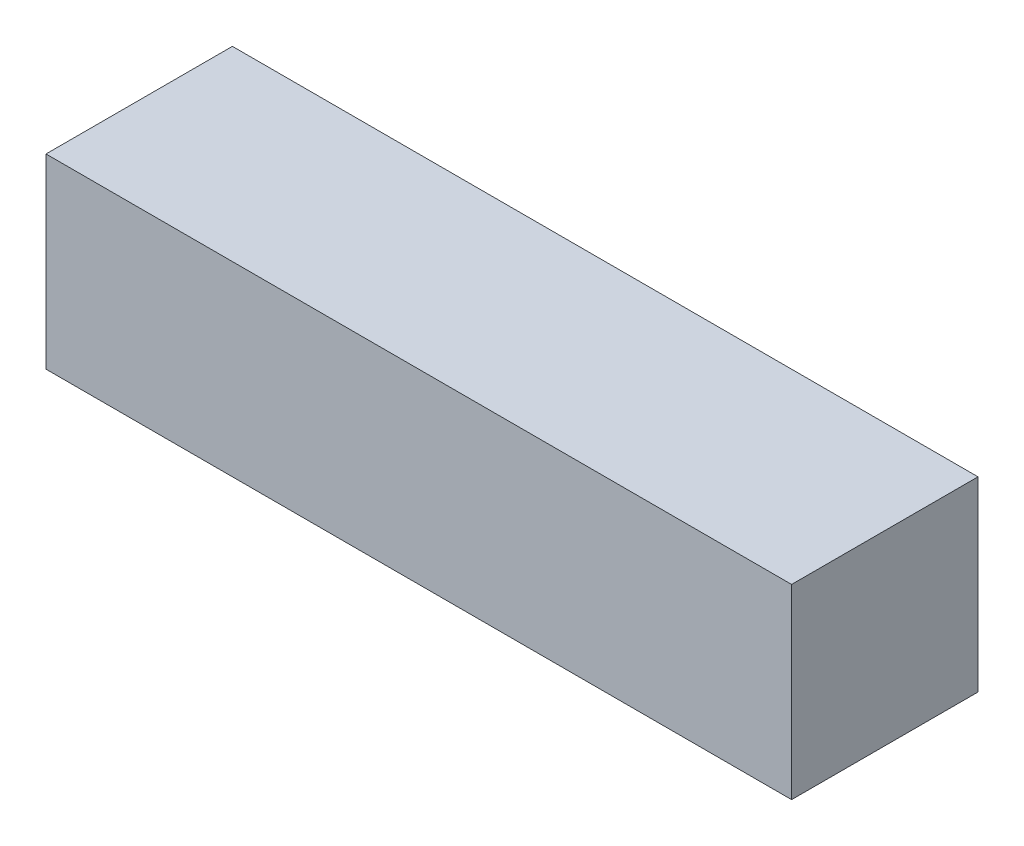
ISO-10303-21;
HEADER;
FILE_DESCRIPTION(('STEP AP214'),'2;1');
FILE_NAME('part.step','',(''),(''),'','','');
FILE_SCHEMA(('AUTOMOTIVE_DESIGN { 1 0 10303 214 1 1 1 1 }'));
ENDSEC;
DATA;
#1=APPLICATION_CONTEXT('core data for automotive mechanical design processes');
#2=APPLICATION_PROTOCOL_DEFINITION('international standard','automotive_design',2000,#1);
#3=PRODUCT_CONTEXT('',#1,'mechanical');
#4=PRODUCT('Part','Part','',(#3));
#5=PRODUCT_RELATED_PRODUCT_CATEGORY('part','',(#4));
#6=PRODUCT_DEFINITION_FORMATION('','',#4);
#7=PRODUCT_DEFINITION_CONTEXT('part definition',#1,'design');
#8=PRODUCT_DEFINITION('design','',#6,#7);
#9=PRODUCT_DEFINITION_SHAPE('','',#8);
#10=(LENGTH_UNIT() NAMED_UNIT(*) SI_UNIT(.MILLI.,.METRE.));
#11=(NAMED_UNIT(*) PLANE_ANGLE_UNIT() SI_UNIT($,.RADIAN.));
#12=(NAMED_UNIT(*) SI_UNIT($,.STERADIAN.) SOLID_ANGLE_UNIT());
#13=UNCERTAINTY_MEASURE_WITH_UNIT(LENGTH_MEASURE(1.E-05),#10,'distance_accuracy_value','');
#14=(GEOMETRIC_REPRESENTATION_CONTEXT(3) GLOBAL_UNCERTAINTY_ASSIGNED_CONTEXT((#13)) GLOBAL_UNIT_ASSIGNED_CONTEXT((#10,
#11,#12)) REPRESENTATION_CONTEXT('',''));
#15=CARTESIAN_POINT('',(0.,0.,0.));
#16=DIRECTION('',(0.,0.,1.));
#17=DIRECTION('',(1.,0.,0.));
#18=AXIS2_PLACEMENT_3D('',#15,#16,#17);
#19=CARTESIAN_POINT('',(0.,0.,35.));
#20=DIRECTION('',(1.,0.,0.));
#21=DIRECTION('',(0.,0.,-1.));
#22=AXIS2_PLACEMENT_3D('',#19,#20,#21);
#23=PLANE('',#22);
#24=DIRECTION('',(0.,-1.,0.));
#25=VECTOR('',#24,1.);
#26=CARTESIAN_POINT('',(0.,0.,0.));
#27=LINE('',#26,#25);
#28=CARTESIAN_POINT('',(0.,35.,0.));
#29=VERTEX_POINT('',#28);
#30=CARTESIAN_POINT('',(0.,0.,0.));
#31=VERTEX_POINT('',#30);
#32=EDGE_CURVE('E98',#29,#31,#27,.T.);
#33=ORIENTED_EDGE('',*,*,#32,.T.);
#34=DIRECTION('',(0.,0.,-1.));
#35=VECTOR('',#34,1.);
#36=CARTESIAN_POINT('',(0.,0.,35.));
#37=LINE('',#36,#35);
#38=CARTESIAN_POINT('',(0.,0.,35.));
#39=VERTEX_POINT('',#38);
#40=EDGE_CURVE('E11',#39,#31,#37,.T.);
#41=ORIENTED_EDGE('',*,*,#40,.F.);
#42=DIRECTION('',(0.,-1.,0.));
#43=VECTOR('',#42,1.);
#44=CARTESIAN_POINT('',(0.,0.,35.));
#45=LINE('',#44,#43);
#46=CARTESIAN_POINT('',(0.,35.,35.));
#47=VERTEX_POINT('',#46);
#48=EDGE_CURVE('E86',#47,#39,#45,.T.);
#49=ORIENTED_EDGE('',*,*,#48,.F.);
#50=DIRECTION('',(0.,0.,-1.));
#51=VECTOR('',#50,1.);
#52=CARTESIAN_POINT('',(0.,35.,35.));
#53=LINE('',#52,#51);
#54=EDGE_CURVE('E94',#47,#29,#53,.T.);
#55=ORIENTED_EDGE('',*,*,#54,.T.);
#56=EDGE_LOOP('',(#33,#41,#49,#55));
#57=FACE_BOUND('',#56,.T.);
#58=ADVANCED_FACE('F35',(#57),#23,.F.);
#59=CARTESIAN_POINT('',(0.,0.,35.));
#60=DIRECTION('',(0.,1.,0.));
#61=DIRECTION('',(0.,0.,1.));
#62=AXIS2_PLACEMENT_3D('',#59,#60,#61);
#63=PLANE('',#62);
#64=DIRECTION('',(1.,0.,0.));
#65=VECTOR('',#64,1.);
#66=CARTESIAN_POINT('',(0.,0.,0.));
#67=LINE('',#66,#65);
#68=CARTESIAN_POINT('',(140.,0.,0.));
#69=VERTEX_POINT('',#68);
#70=EDGE_CURVE('E90',#31,#69,#67,.T.);
#71=ORIENTED_EDGE('',*,*,#70,.T.);
#72=DIRECTION('',(0.,0.,-1.));
#73=VECTOR('',#72,1.);
#74=CARTESIAN_POINT('',(140.,0.,35.));
#75=LINE('',#74,#73);
#76=CARTESIAN_POINT('',(140.,0.,35.));
#77=VERTEX_POINT('',#76);
#78=EDGE_CURVE('E43',#77,#69,#75,.T.);
#79=ORIENTED_EDGE('',*,*,#78,.F.);
#80=DIRECTION('',(1.,0.,0.));
#81=VECTOR('',#80,1.);
#82=CARTESIAN_POINT('',(0.,0.,35.));
#83=LINE('',#82,#81);
#84=EDGE_CURVE('E81',#39,#77,#83,.T.);
#85=ORIENTED_EDGE('',*,*,#84,.F.);
#86=ORIENTED_EDGE('',*,*,#40,.T.);
#87=EDGE_LOOP('',(#71,#79,#85,#86));
#88=FACE_BOUND('',#87,.T.);
#89=ADVANCED_FACE('F89',(#88),#63,.F.);
#90=CARTESIAN_POINT('',(140.,0.,35.));
#91=DIRECTION('',(-1.,0.,0.));
#92=DIRECTION('',(0.,0.,1.));
#93=AXIS2_PLACEMENT_3D('',#90,#91,#92);
#94=PLANE('',#93);
#95=DIRECTION('',(0.,1.,0.));
#96=VECTOR('',#95,1.);
#97=CARTESIAN_POINT('',(140.,0.,0.));
#98=LINE('',#97,#96);
#99=CARTESIAN_POINT('',(140.,35.,0.));
#100=VERTEX_POINT('',#99);
#101=EDGE_CURVE('E68',#69,#100,#98,.T.);
#102=ORIENTED_EDGE('',*,*,#101,.T.);
#103=DIRECTION('',(0.,0.,-1.));
#104=VECTOR('',#103,1.);
#105=CARTESIAN_POINT('',(140.,35.,35.));
#106=LINE('',#105,#104);
#107=CARTESIAN_POINT('',(140.,35.,35.));
#108=VERTEX_POINT('',#107);
#109=EDGE_CURVE('E91',#108,#100,#106,.T.);
#110=ORIENTED_EDGE('',*,*,#109,.F.);
#111=DIRECTION('',(0.,1.,0.));
#112=VECTOR('',#111,1.);
#113=CARTESIAN_POINT('',(140.,0.,35.));
#114=LINE('',#113,#112);
#115=EDGE_CURVE('E84',#77,#108,#114,.T.);
#116=ORIENTED_EDGE('',*,*,#115,.F.);
#117=ORIENTED_EDGE('',*,*,#78,.T.);
#118=EDGE_LOOP('',(#102,#110,#116,#117));
#119=FACE_BOUND('',#118,.T.);
#120=ADVANCED_FACE('F92',(#119),#94,.F.);
#121=CARTESIAN_POINT('',(0.,35.,35.));
#122=DIRECTION('',(0.,-1.,0.));
#123=DIRECTION('',(0.,0.,-1.));
#124=AXIS2_PLACEMENT_3D('',#121,#122,#123);
#125=PLANE('',#124);
#126=DIRECTION('',(-1.,0.,0.));
#127=VECTOR('',#126,1.);
#128=CARTESIAN_POINT('',(0.,35.,0.));
#129=LINE('',#128,#127);
#130=EDGE_CURVE('E74',#100,#29,#129,.T.);
#131=ORIENTED_EDGE('',*,*,#130,.T.);
#132=ORIENTED_EDGE('',*,*,#54,.F.);
#133=DIRECTION('',(-1.,0.,0.));
#134=VECTOR('',#133,1.);
#135=CARTESIAN_POINT('',(0.,35.,35.));
#136=LINE('',#135,#134);
#137=EDGE_CURVE('E51',#108,#47,#136,.T.);
#138=ORIENTED_EDGE('',*,*,#137,.F.);
#139=ORIENTED_EDGE('',*,*,#109,.T.);
#140=EDGE_LOOP('',(#131,#132,#138,#139));
#141=FACE_BOUND('',#140,.T.);
#142=ADVANCED_FACE('F105',(#141),#125,.F.);
#143=CARTESIAN_POINT('',(0.,0.,35.));
#144=DIRECTION('',(0.,0.,-1.));
#145=DIRECTION('',(-1.,0.,0.));
#146=AXIS2_PLACEMENT_3D('',#143,#144,#145);
#147=PLANE('',#146);
#148=ORIENTED_EDGE('',*,*,#48,.T.);
#149=ORIENTED_EDGE('',*,*,#84,.T.);
#150=ORIENTED_EDGE('',*,*,#115,.T.);
#151=ORIENTED_EDGE('',*,*,#137,.T.);
#152=EDGE_LOOP('',(#148,#149,#150,#151));
#153=FACE_BOUND('',#152,.T.);
#154=ADVANCED_FACE('F82',(#153),#147,.F.);
#155=CARTESIAN_POINT('',(0.,0.,0.));
#156=DIRECTION('',(0.,0.,-1.));
#157=DIRECTION('',(-1.,0.,0.));
#158=AXIS2_PLACEMENT_3D('',#155,#156,#157);
#159=PLANE('',#158);
#160=ORIENTED_EDGE('',*,*,#32,.F.);
#161=ORIENTED_EDGE('',*,*,#130,.F.);
#162=ORIENTED_EDGE('',*,*,#101,.F.);
#163=ORIENTED_EDGE('',*,*,#70,.F.);
#164=EDGE_LOOP('',(#160,#161,#162,#163));
#165=FACE_BOUND('',#164,.T.);
#166=ADVANCED_FACE('F108',(#165),#159,.T.);
#167=CLOSED_SHELL('',(#58,#89,#120,#142,#154,#166));
#168=MANIFOLD_SOLID_BREP('B2',#167);
#169=ADVANCED_BREP_SHAPE_REPRESENTATION('',(#18,#168),#14);
#170=SHAPE_DEFINITION_REPRESENTATION(#9,#169);
ENDSEC;
END-ISO-10303-21;
